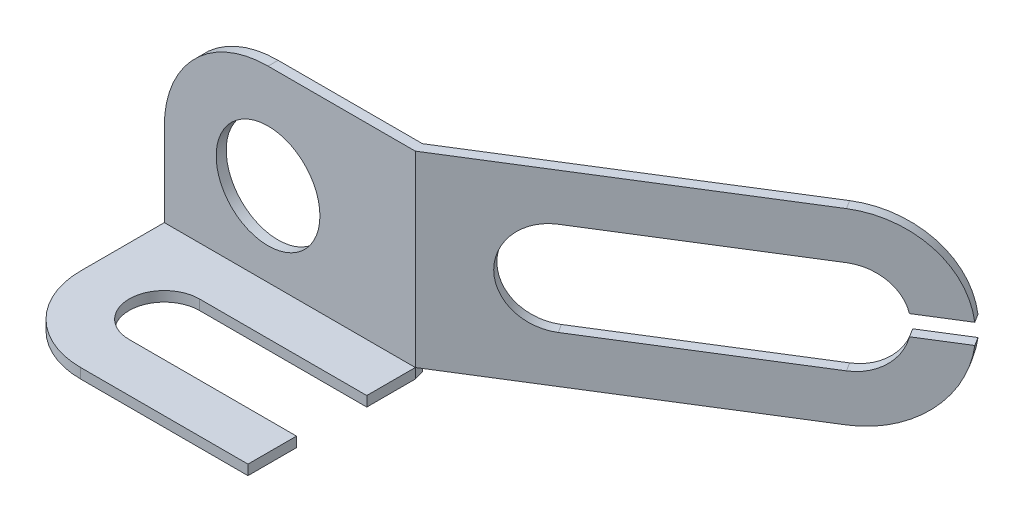
ISO-10303-21;
HEADER;
FILE_DESCRIPTION(('STEP AP214'),'2;1');
FILE_NAME('part.step','',(''),(''),'','','');
FILE_SCHEMA(('AUTOMOTIVE_DESIGN { 1 0 10303 214 1 1 1 1 }'));
ENDSEC;
DATA;
#1=APPLICATION_CONTEXT('core data for automotive mechanical design processes');
#2=APPLICATION_PROTOCOL_DEFINITION('international standard','automotive_design',2000,#1);
#3=PRODUCT_CONTEXT('',#1,'mechanical');
#4=PRODUCT('Part','Part','',(#3));
#5=PRODUCT_RELATED_PRODUCT_CATEGORY('part','',(#4));
#6=PRODUCT_DEFINITION_FORMATION('','',#4);
#7=PRODUCT_DEFINITION_CONTEXT('part definition',#1,'design');
#8=PRODUCT_DEFINITION('design','',#6,#7);
#9=PRODUCT_DEFINITION_SHAPE('','',#8);
#10=(LENGTH_UNIT() NAMED_UNIT(*) SI_UNIT(.MILLI.,.METRE.));
#11=(NAMED_UNIT(*) PLANE_ANGLE_UNIT() SI_UNIT($,.RADIAN.));
#12=(NAMED_UNIT(*) SI_UNIT($,.STERADIAN.) SOLID_ANGLE_UNIT());
#13=UNCERTAINTY_MEASURE_WITH_UNIT(LENGTH_MEASURE(1.E-05),#10,'distance_accuracy_value','');
#14=(GEOMETRIC_REPRESENTATION_CONTEXT(3) GLOBAL_UNCERTAINTY_ASSIGNED_CONTEXT((#13)) GLOBAL_UNIT_ASSIGNED_CONTEXT((#10,
#11,#12)) REPRESENTATION_CONTEXT('',''));
#15=CARTESIAN_POINT('',(0.,0.,0.));
#16=DIRECTION('',(0.,0.,1.));
#17=DIRECTION('',(1.,0.,0.));
#18=AXIS2_PLACEMENT_3D('',#15,#16,#17);
#19=CARTESIAN_POINT('',(0.,1.524,7.366));
#20=DIRECTION('',(-1.,0.,0.));
#21=DIRECTION('',(0.,0.,1.));
#22=AXIS2_PLACEMENT_3D('',#19,#20,#21);
#23=PLANE('',#22);
#24=DIRECTION('',(0.,0.,-1.));
#25=VECTOR('',#24,1.);
#26=CARTESIAN_POINT('',(0.,0.,7.366));
#27=LINE('',#26,#25);
#28=CARTESIAN_POINT('',(0.,0.,7.366));
#29=VERTEX_POINT('',#28);
#30=CARTESIAN_POINT('',(0.,0.,0.));
#31=VERTEX_POINT('',#30);
#32=EDGE_CURVE('E156',#29,#31,#27,.T.);
#33=ORIENTED_EDGE('',*,*,#32,.T.);
#34=DIRECTION('',(0.,-1.,0.));
#35=VECTOR('',#34,1.);
#36=CARTESIAN_POINT('',(0.,3.10941634025308,0.));
#37=LINE('',#36,#35);
#38=CARTESIAN_POINT('',(0.,1.524,0.));
#39=VERTEX_POINT('',#38);
#40=EDGE_CURVE('E342',#39,#31,#37,.T.);
#41=ORIENTED_EDGE('',*,*,#40,.F.);
#42=DIRECTION('',(0.,0.,-1.));
#43=VECTOR('',#42,1.);
#44=CARTESIAN_POINT('',(0.,1.524,7.366));
#45=LINE('',#44,#43);
#46=CARTESIAN_POINT('',(0.,1.524,7.366));
#47=VERTEX_POINT('',#46);
#48=EDGE_CURVE('E172',#47,#39,#45,.T.);
#49=ORIENTED_EDGE('',*,*,#48,.F.);
#50=DIRECTION('',(0.,-1.,0.));
#51=VECTOR('',#50,1.);
#52=CARTESIAN_POINT('',(0.,1.524,7.366));
#53=LINE('',#52,#51);
#54=EDGE_CURVE('E152',#47,#29,#53,.T.);
#55=ORIENTED_EDGE('',*,*,#54,.T.);
#56=EDGE_LOOP('',(#33,#41,#49,#55));
#57=FACE_BOUND('',#56,.T.);
#58=ADVANCED_FACE('F48',(#57),#23,.F.);
#59=CARTESIAN_POINT('',(-38.1,1.524,0.));
#60=DIRECTION('',(1.,0.,0.));
#61=DIRECTION('',(0.,0.,-1.));
#62=AXIS2_PLACEMENT_3D('',#59,#60,#61);
#63=PLANE('',#62);
#64=DIRECTION('',(0.,0.,1.));
#65=VECTOR('',#64,1.);
#66=CARTESIAN_POINT('',(-38.1,0.,0.));
#67=LINE('',#66,#65);
#68=CARTESIAN_POINT('',(-38.1,0.,-1.524));
#69=VERTEX_POINT('',#68);
#70=CARTESIAN_POINT('',(-38.1,0.,12.6999999999999));
#71=VERTEX_POINT('',#70);
#72=EDGE_CURVE('E159',#69,#71,#67,.T.);
#73=ORIENTED_EDGE('',*,*,#72,.T.);
#74=DIRECTION('',(0.,-1.,0.));
#75=VECTOR('',#74,1.);
#76=CARTESIAN_POINT('',(-38.1,1.524,12.6999999999999));
#77=LINE('',#76,#75);
#78=CARTESIAN_POINT('',(-38.1,1.524,12.6999999999999));
#79=VERTEX_POINT('',#78);
#80=EDGE_CURVE('E55',#79,#71,#77,.T.);
#81=ORIENTED_EDGE('',*,*,#80,.F.);
#82=DIRECTION('',(0.,0.,1.));
#83=VECTOR('',#82,1.);
#84=CARTESIAN_POINT('',(-38.1,1.524,0.));
#85=LINE('',#84,#83);
#86=CARTESIAN_POINT('',(-38.1,1.524,0.));
#87=VERTEX_POINT('',#86);
#88=EDGE_CURVE('E209',#87,#79,#85,.T.);
#89=ORIENTED_EDGE('',*,*,#88,.F.);
#90=DIRECTION('',(0.,-1.,0.));
#91=VECTOR('',#90,1.);
#92=CARTESIAN_POINT('',(-38.1,14.224,0.));
#93=LINE('',#92,#91);
#94=CARTESIAN_POINT('',(-38.1,14.224,0.));
#95=VERTEX_POINT('',#94);
#96=EDGE_CURVE('E110',#95,#87,#93,.T.);
#97=ORIENTED_EDGE('',*,*,#96,.F.);
#98=DIRECTION('',(0.,0.,1.));
#99=VECTOR('',#98,1.);
#100=CARTESIAN_POINT('',(-38.1,14.224,-1.524));
#101=LINE('',#100,#99);
#102=CARTESIAN_POINT('',(-38.1,14.224,-1.524));
#103=VERTEX_POINT('',#102);
#104=EDGE_CURVE('E160',#103,#95,#101,.T.);
#105=ORIENTED_EDGE('',*,*,#104,.F.);
#106=DIRECTION('',(0.,-1.,0.));
#107=VECTOR('',#106,1.);
#108=CARTESIAN_POINT('',(-38.1,14.224,-1.524));
#109=LINE('',#108,#107);
#110=EDGE_CURVE('E217',#103,#69,#109,.T.);
#111=ORIENTED_EDGE('',*,*,#110,.T.);
#112=EDGE_LOOP('',(#73,#81,#89,#97,#105,#111));
#113=FACE_BOUND('',#112,.T.);
#114=ADVANCED_FACE('F422',(#113),#63,.F.);
#115=CARTESIAN_POINT('',(-25.4,1.524,12.7));
#116=DIRECTION('',(0.,-1.,0.));
#117=DIRECTION('',(0.,0.,-1.));
#118=AXIS2_PLACEMENT_3D('',#115,#116,#117);
#119=CYLINDRICAL_SURFACE('',#118,12.7);
#120=CARTESIAN_POINT('',(-25.4,0.,12.7));
#121=DIRECTION('',(0.,1.,0.));
#122=DIRECTION('',(0.,0.,-1.));
#123=AXIS2_PLACEMENT_3D('',#120,#121,#122);
#124=CIRCLE('',#123,12.7);
#125=CARTESIAN_POINT('',(-25.3999999999999,0.,25.4));
#126=VERTEX_POINT('',#125);
#127=EDGE_CURVE('E162',#71,#126,#124,.T.);
#128=ORIENTED_EDGE('',*,*,#127,.T.);
#129=DIRECTION('',(0.,-1.,0.));
#130=VECTOR('',#129,1.);
#131=CARTESIAN_POINT('',(-25.3999999999999,1.524,25.4));
#132=LINE('',#131,#130);
#133=CARTESIAN_POINT('',(-25.3999999999999,1.524,25.4));
#134=VERTEX_POINT('',#133);
#135=EDGE_CURVE('E179',#134,#126,#132,.T.);
#136=ORIENTED_EDGE('',*,*,#135,.F.);
#137=CARTESIAN_POINT('',(-25.4,1.524,12.7));
#138=DIRECTION('',(0.,1.,0.));
#139=DIRECTION('',(0.,0.,-1.));
#140=AXIS2_PLACEMENT_3D('',#137,#138,#139);
#141=CIRCLE('',#140,12.7);
#142=EDGE_CURVE('E188',#79,#134,#141,.T.);
#143=ORIENTED_EDGE('',*,*,#142,.F.);
#144=ORIENTED_EDGE('',*,*,#80,.T.);
#145=EDGE_LOOP('',(#128,#136,#143,#144));
#146=FACE_BOUND('',#145,.T.);
#147=ADVANCED_FACE('F186',(#146),#119,.T.);
#148=CARTESIAN_POINT('',(-25.3999999999999,1.524,25.4));
#149=DIRECTION('',(0.,0.,-1.));
#150=DIRECTION('',(-1.,0.,0.));
#151=AXIS2_PLACEMENT_3D('',#148,#149,#150);
#152=PLANE('',#151);
#153=DIRECTION('',(1.,0.,0.));
#154=VECTOR('',#153,1.);
#155=CARTESIAN_POINT('',(-25.3999999999999,0.,25.4));
#156=LINE('',#155,#154);
#157=CARTESIAN_POINT('',(0.,0.,25.4));
#158=VERTEX_POINT('',#157);
#159=EDGE_CURVE('E164',#126,#158,#156,.T.);
#160=ORIENTED_EDGE('',*,*,#159,.T.);
#161=DIRECTION('',(0.,-1.,0.));
#162=VECTOR('',#161,1.);
#163=CARTESIAN_POINT('',(0.,1.524,25.4));
#164=LINE('',#163,#162);
#165=CARTESIAN_POINT('',(0.,1.524,25.4));
#166=VERTEX_POINT('',#165);
#167=EDGE_CURVE('E176',#166,#158,#164,.T.);
#168=ORIENTED_EDGE('',*,*,#167,.F.);
#169=DIRECTION('',(1.,0.,0.));
#170=VECTOR('',#169,1.);
#171=CARTESIAN_POINT('',(-25.3999999999999,1.524,25.4));
#172=LINE('',#171,#170);
#173=EDGE_CURVE('E205',#134,#166,#172,.T.);
#174=ORIENTED_EDGE('',*,*,#173,.F.);
#175=ORIENTED_EDGE('',*,*,#135,.T.);
#176=EDGE_LOOP('',(#160,#168,#174,#175));
#177=FACE_BOUND('',#176,.T.);
#178=ADVANCED_FACE('F201',(#177),#152,.F.);
#179=CARTESIAN_POINT('',(0.,1.524,25.4));
#180=DIRECTION('',(-1.,0.,0.));
#181=DIRECTION('',(0.,0.,1.));
#182=AXIS2_PLACEMENT_3D('',#179,#180,#181);
#183=PLANE('',#182);
#184=DIRECTION('',(0.,0.,-1.));
#185=VECTOR('',#184,1.);
#186=CARTESIAN_POINT('',(0.,0.,25.4));
#187=LINE('',#186,#185);
#188=CARTESIAN_POINT('',(0.,0.,18.034));
#189=VERTEX_POINT('',#188);
#190=EDGE_CURVE('E166',#158,#189,#187,.T.);
#191=ORIENTED_EDGE('',*,*,#190,.T.);
#192=DIRECTION('',(0.,-1.,0.));
#193=VECTOR('',#192,1.);
#194=CARTESIAN_POINT('',(0.,1.524,18.034));
#195=LINE('',#194,#193);
#196=CARTESIAN_POINT('',(0.,1.524,18.034));
#197=VERTEX_POINT('',#196);
#198=EDGE_CURVE('E147',#197,#189,#195,.T.);
#199=ORIENTED_EDGE('',*,*,#198,.F.);
#200=DIRECTION('',(0.,0.,-1.));
#201=VECTOR('',#200,1.);
#202=CARTESIAN_POINT('',(0.,1.524,25.4));
#203=LINE('',#202,#201);
#204=EDGE_CURVE('E135',#166,#197,#203,.T.);
#205=ORIENTED_EDGE('',*,*,#204,.F.);
#206=ORIENTED_EDGE('',*,*,#167,.T.);
#207=EDGE_LOOP('',(#191,#199,#205,#206));
#208=FACE_BOUND('',#207,.T.);
#209=ADVANCED_FACE('F204',(#208),#183,.F.);
#210=CARTESIAN_POINT('',(0.,1.524,18.034));
#211=DIRECTION('',(0.,0.,1.));
#212=DIRECTION('',(1.,0.,0.));
#213=AXIS2_PLACEMENT_3D('',#210,#211,#212);
#214=PLANE('',#213);
#215=DIRECTION('',(-1.,0.,0.));
#216=VECTOR('',#215,1.);
#217=CARTESIAN_POINT('',(0.,0.,18.034));
#218=LINE('',#217,#216);
#219=CARTESIAN_POINT('',(-25.4,0.,18.034));
#220=VERTEX_POINT('',#219);
#221=EDGE_CURVE('E144',#189,#220,#218,.T.);
#222=ORIENTED_EDGE('',*,*,#221,.T.);
#223=DIRECTION('',(0.,-1.,0.));
#224=VECTOR('',#223,1.);
#225=CARTESIAN_POINT('',(-25.4,1.524,18.034));
#226=LINE('',#225,#224);
#227=CARTESIAN_POINT('',(-25.4,1.524,18.034));
#228=VERTEX_POINT('',#227);
#229=EDGE_CURVE('E141',#228,#220,#226,.T.);
#230=ORIENTED_EDGE('',*,*,#229,.F.);
#231=DIRECTION('',(-1.,0.,0.));
#232=VECTOR('',#231,1.);
#233=CARTESIAN_POINT('',(0.,1.524,18.034));
#234=LINE('',#233,#232);
#235=EDGE_CURVE('E128',#197,#228,#234,.T.);
#236=ORIENTED_EDGE('',*,*,#235,.F.);
#237=ORIENTED_EDGE('',*,*,#198,.T.);
#238=EDGE_LOOP('',(#222,#230,#236,#237));
#239=FACE_BOUND('',#238,.T.);
#240=ADVANCED_FACE('F142',(#239),#214,.F.);
#241=CARTESIAN_POINT('',(-25.4,1.524,12.7));
#242=DIRECTION('',(0.,-1.,0.));
#243=DIRECTION('',(0.,0.,-1.));
#244=AXIS2_PLACEMENT_3D('',#241,#242,#243);
#245=CYLINDRICAL_SURFACE('',#244,5.334);
#246=CARTESIAN_POINT('',(-25.4,0.,12.7));
#247=DIRECTION('',(0.,-1.,0.));
#248=DIRECTION('',(0.,0.,1.));
#249=AXIS2_PLACEMENT_3D('',#246,#247,#248);
#250=CIRCLE('',#249,5.334);
#251=CARTESIAN_POINT('',(-25.4,0.,7.366));
#252=VERTEX_POINT('',#251);
#253=EDGE_CURVE('E169',#220,#252,#250,.T.);
#254=ORIENTED_EDGE('',*,*,#253,.T.);
#255=DIRECTION('',(0.,-1.,0.));
#256=VECTOR('',#255,1.);
#257=CARTESIAN_POINT('',(-25.4,1.524,7.366));
#258=LINE('',#257,#256);
#259=CARTESIAN_POINT('',(-25.4,1.524,7.366));
#260=VERTEX_POINT('',#259);
#261=EDGE_CURVE('E148',#260,#252,#258,.T.);
#262=ORIENTED_EDGE('',*,*,#261,.F.);
#263=CARTESIAN_POINT('',(-25.4,1.524,12.7));
#264=DIRECTION('',(0.,-1.,0.));
#265=DIRECTION('',(0.,0.,1.));
#266=AXIS2_PLACEMENT_3D('',#263,#264,#265);
#267=CIRCLE('',#266,5.334);
#268=EDGE_CURVE('E132',#228,#260,#267,.T.);
#269=ORIENTED_EDGE('',*,*,#268,.F.);
#270=ORIENTED_EDGE('',*,*,#229,.T.);
#271=EDGE_LOOP('',(#254,#262,#269,#270));
#272=FACE_BOUND('',#271,.T.);
#273=ADVANCED_FACE('F150',(#272),#245,.F.);
#274=CARTESIAN_POINT('',(-25.4,1.524,7.366));
#275=DIRECTION('',(0.,0.,-1.));
#276=DIRECTION('',(-1.,0.,0.));
#277=AXIS2_PLACEMENT_3D('',#274,#275,#276);
#278=PLANE('',#277);
#279=DIRECTION('',(1.,0.,0.));
#280=VECTOR('',#279,1.);
#281=CARTESIAN_POINT('',(-25.4,0.,7.366));
#282=LINE('',#281,#280);
#283=EDGE_CURVE('E101',#252,#29,#282,.T.);
#284=ORIENTED_EDGE('',*,*,#283,.T.);
#285=ORIENTED_EDGE('',*,*,#54,.F.);
#286=DIRECTION('',(1.,0.,0.));
#287=VECTOR('',#286,1.);
#288=CARTESIAN_POINT('',(-25.4,1.524,7.366));
#289=LINE('',#288,#287);
#290=EDGE_CURVE('E71',#260,#47,#289,.T.);
#291=ORIENTED_EDGE('',*,*,#290,.F.);
#292=ORIENTED_EDGE('',*,*,#261,.T.);
#293=EDGE_LOOP('',(#284,#285,#291,#292));
#294=FACE_BOUND('',#293,.T.);
#295=ADVANCED_FACE('F497',(#294),#278,.F.);
#296=CARTESIAN_POINT('',(-25.4,1.524,12.7));
#297=DIRECTION('',(0.,-1.,0.));
#298=DIRECTION('',(0.,0.,-1.));
#299=AXIS2_PLACEMENT_3D('',#296,#297,#298);
#300=PLANE('',#299);
#301=ORIENTED_EDGE('',*,*,#48,.T.);
#302=DIRECTION('',(-1.,0.,0.));
#303=VECTOR('',#302,1.);
#304=CARTESIAN_POINT('',(0.,1.524,0.));
#305=LINE('',#304,#303);
#306=EDGE_CURVE('E211',#39,#87,#305,.T.);
#307=ORIENTED_EDGE('',*,*,#306,.T.);
#308=ORIENTED_EDGE('',*,*,#88,.T.);
#309=ORIENTED_EDGE('',*,*,#142,.T.);
#310=ORIENTED_EDGE('',*,*,#173,.T.);
#311=ORIENTED_EDGE('',*,*,#204,.T.);
#312=ORIENTED_EDGE('',*,*,#235,.T.);
#313=ORIENTED_EDGE('',*,*,#268,.T.);
#314=ORIENTED_EDGE('',*,*,#290,.T.);
#315=EDGE_LOOP('',(#301,#307,#308,#309,#310,#311,#312,#313,#314));
#316=FACE_BOUND('',#315,.T.);
#317=ADVANCED_FACE('F130',(#316),#300,.F.);
#318=CARTESIAN_POINT('',(-25.4,0.,12.7));
#319=DIRECTION('',(0.,-1.,0.));
#320=DIRECTION('',(0.,0.,-1.));
#321=AXIS2_PLACEMENT_3D('',#318,#319,#320);
#322=PLANE('',#321);
#323=DIRECTION('',(-0.275637355816991,0.,-0.961261695938321));
#324=VECTOR('',#323,1.);
#325=CARTESIAN_POINT('',(0.,0.,0.));
#326=LINE('',#325,#324);
#327=CARTESIAN_POINT('',(-0.436999967896409,0.,-1.524));
#328=VERTEX_POINT('',#327);
#329=EDGE_CURVE('E345',#31,#328,#326,.T.);
#330=ORIENTED_EDGE('',*,*,#329,.F.);
#331=ORIENTED_EDGE('',*,*,#32,.F.);
#332=ORIENTED_EDGE('',*,*,#283,.F.);
#333=ORIENTED_EDGE('',*,*,#253,.F.);
#334=ORIENTED_EDGE('',*,*,#221,.F.);
#335=ORIENTED_EDGE('',*,*,#190,.F.);
#336=ORIENTED_EDGE('',*,*,#159,.F.);
#337=ORIENTED_EDGE('',*,*,#127,.F.);
#338=ORIENTED_EDGE('',*,*,#72,.F.);
#339=DIRECTION('',(1.,0.,0.));
#340=VECTOR('',#339,1.);
#341=CARTESIAN_POINT('',(0.,0.,-1.524));
#342=LINE('',#341,#340);
#343=EDGE_CURVE('E221',#69,#328,#342,.T.);
#344=ORIENTED_EDGE('',*,*,#343,.T.);
#345=EDGE_LOOP('',(#330,#331,#332,#333,#334,#335,#336,#337,#338,#344));
#346=FACE_BOUND('',#345,.T.);
#347=ADVANCED_FACE('F195',(#346),#322,.T.);
#348=CARTESIAN_POINT('',(-22.352,14.224,0.));
#349=DIRECTION('',(0.,0.,1.));
#350=DIRECTION('',(1.,0.,0.));
#351=AXIS2_PLACEMENT_3D('',#348,#349,#350);
#352=PLANE('',#351);
#353=CARTESIAN_POINT('',(-22.352,14.224,0.));
#354=DIRECTION('',(0.,0.,1.));
#355=DIRECTION('',(1.,0.,0.));
#356=AXIS2_PLACEMENT_3D('',#353,#354,#355);
#357=CIRCLE('',#356,7.874);
#358=CARTESIAN_POINT('',(-14.478,14.224,0.));
#359=VERTEX_POINT('',#358);
#360=EDGE_CURVE('E240',#359,#359,#357,.T.);
#361=ORIENTED_EDGE('',*,*,#360,.F.);
#362=EDGE_LOOP('',(#361));
#363=FACE_BOUND('',#362,.T.);
#364=ORIENTED_EDGE('',*,*,#306,.F.);
#365=DIRECTION('',(0.,1.,0.));
#366=VECTOR('',#365,1.);
#367=CARTESIAN_POINT('',(0.,0.,0.));
#368=LINE('',#367,#366);
#369=CARTESIAN_POINT('',(0.,29.972,0.));
#370=VERTEX_POINT('',#369);
#371=EDGE_CURVE('E227',#39,#370,#368,.T.);
#372=ORIENTED_EDGE('',*,*,#371,.T.);
#373=DIRECTION('',(-1.,0.,0.));
#374=VECTOR('',#373,1.);
#375=CARTESIAN_POINT('',(0.,29.972,0.));
#376=LINE('',#375,#374);
#377=CARTESIAN_POINT('',(-22.352,29.972,0.));
#378=VERTEX_POINT('',#377);
#379=EDGE_CURVE('E224',#370,#378,#376,.T.);
#380=ORIENTED_EDGE('',*,*,#379,.T.);
#381=CARTESIAN_POINT('',(-22.352,14.224,0.));
#382=DIRECTION('',(0.,0.,1.));
#383=DIRECTION('',(1.,0.,0.));
#384=AXIS2_PLACEMENT_3D('',#381,#382,#383);
#385=CIRCLE('',#384,15.748);
#386=EDGE_CURVE('E222',#378,#95,#385,.T.);
#387=ORIENTED_EDGE('',*,*,#386,.T.);
#388=ORIENTED_EDGE('',*,*,#96,.T.);
#389=EDGE_LOOP('',(#364,#372,#380,#387,#388));
#390=FACE_BOUND('',#389,.T.);
#391=ADVANCED_FACE('F421',(#363,#390),#352,.T.);
#392=CARTESIAN_POINT('',(-22.352,14.224,-1.524));
#393=DIRECTION('',(0.,0.,1.));
#394=DIRECTION('',(1.,0.,0.));
#395=AXIS2_PLACEMENT_3D('',#392,#393,#394);
#396=CYLINDRICAL_SURFACE('',#395,15.748);
#397=ORIENTED_EDGE('',*,*,#386,.F.);
#398=DIRECTION('',(0.,0.,1.));
#399=VECTOR('',#398,1.);
#400=CARTESIAN_POINT('',(-22.352,29.972,-1.524));
#401=LINE('',#400,#399);
#402=CARTESIAN_POINT('',(-22.352,29.972,-1.524));
#403=VERTEX_POINT('',#402);
#404=EDGE_CURVE('E214',#403,#378,#401,.T.);
#405=ORIENTED_EDGE('',*,*,#404,.F.);
#406=CARTESIAN_POINT('',(-22.352,14.224,-1.524));
#407=DIRECTION('',(0.,0.,1.));
#408=DIRECTION('',(1.,0.,0.));
#409=AXIS2_PLACEMENT_3D('',#406,#407,#408);
#410=CIRCLE('',#409,15.748);
#411=EDGE_CURVE('E233',#403,#103,#410,.T.);
#412=ORIENTED_EDGE('',*,*,#411,.T.);
#413=ORIENTED_EDGE('',*,*,#104,.T.);
#414=EDGE_LOOP('',(#397,#405,#412,#413));
#415=FACE_BOUND('',#414,.T.);
#416=ADVANCED_FACE('F420',(#415),#396,.T.);
#417=CARTESIAN_POINT('',(0.,29.972,-1.524));
#418=DIRECTION('',(0.,1.,0.));
#419=DIRECTION('',(-1.,0.,0.));
#420=AXIS2_PLACEMENT_3D('',#417,#418,#419);
#421=PLANE('',#420);
#422=ORIENTED_EDGE('',*,*,#379,.F.);
#423=DIRECTION('',(-0.848048096156425,0.,0.529919264233206));
#424=VECTOR('',#423,1.);
#425=CARTESIAN_POINT('',(0.,29.972,0.));
#426=LINE('',#425,#424);
#427=CARTESIAN_POINT('',(40.2805884712379,29.972,-25.1701052125488));
#428=VERTEX_POINT('',#427);
#429=EDGE_CURVE('E276',#428,#370,#426,.T.);
#430=ORIENTED_EDGE('',*,*,#429,.F.);
#431=DIRECTION('',(0.529919264233206,0.,0.848048096156425));
#432=VECTOR('',#431,1.);
#433=CARTESIAN_POINT('',(39.4729915125465,29.972,-26.4625305110912));
#434=LINE('',#433,#432);
#435=CARTESIAN_POINT('',(39.4729915125465,29.972,-26.4625305110912));
#436=VERTEX_POINT('',#435);
#437=EDGE_CURVE('E243',#436,#428,#434,.T.);
#438=ORIENTED_EDGE('',*,*,#437,.F.);
#439=DIRECTION('',(-0.848048096156425,0.,0.529919264233206));
#440=VECTOR('',#439,1.);
#441=CARTESIAN_POINT('',(-0.807596958691406,29.972,-1.29242529854239));
#442=LINE('',#441,#440);
#443=CARTESIAN_POINT('',(-0.436999967896413,29.972,-1.52400000000001));
#444=VERTEX_POINT('',#443);
#445=EDGE_CURVE('E250',#436,#444,#442,.T.);
#446=ORIENTED_EDGE('',*,*,#445,.T.);
#447=DIRECTION('',(-1.,0.,0.));
#448=VECTOR('',#447,1.);
#449=CARTESIAN_POINT('',(0.,29.972,-1.524));
#450=LINE('',#449,#448);
#451=EDGE_CURVE('E236',#444,#403,#450,.T.);
#452=ORIENTED_EDGE('',*,*,#451,.T.);
#453=ORIENTED_EDGE('',*,*,#404,.T.);
#454=EDGE_LOOP('',(#422,#430,#438,#446,#452,#453));
#455=FACE_BOUND('',#454,.T.);
#456=ADVANCED_FACE('F376',(#455),#421,.T.);
#457=CARTESIAN_POINT('',(-22.352,14.224,-1.524));
#458=DIRECTION('',(0.,0.,1.));
#459=DIRECTION('',(1.,0.,0.));
#460=AXIS2_PLACEMENT_3D('',#457,#458,#459);
#461=PLANE('',#460);
#462=CARTESIAN_POINT('',(-22.352,14.224,-1.524));
#463=DIRECTION('',(0.,0.,1.));
#464=DIRECTION('',(1.,0.,0.));
#465=AXIS2_PLACEMENT_3D('',#462,#463,#464);
#466=CIRCLE('',#465,7.874);
#467=CARTESIAN_POINT('',(-14.478,14.224,-1.524));
#468=VERTEX_POINT('',#467);
#469=EDGE_CURVE('E230',#468,#468,#466,.T.);
#470=ORIENTED_EDGE('',*,*,#469,.T.);
#471=EDGE_LOOP('',(#470));
#472=FACE_BOUND('',#471,.T.);
#473=DIRECTION('',(0.,-1.,0.));
#474=VECTOR('',#473,1.);
#475=CARTESIAN_POINT('',(-0.436999967896409,14.224,-1.524));
#476=LINE('',#475,#474);
#477=CARTESIAN_POINT('',(-0.436999967896409,1.524,-1.524));
#478=VERTEX_POINT('',#477);
#479=EDGE_CURVE('E13',#444,#478,#476,.T.);
#480=ORIENTED_EDGE('',*,*,#479,.T.);
#481=DIRECTION('',(0.,-1.,0.));
#482=VECTOR('',#481,1.);
#483=CARTESIAN_POINT('',(-0.436999967896409,3.10941634025308,-1.524));
#484=LINE('',#483,#482);
#485=EDGE_CURVE('E341',#478,#328,#484,.T.);
#486=ORIENTED_EDGE('',*,*,#485,.T.);
#487=ORIENTED_EDGE('',*,*,#343,.F.);
#488=ORIENTED_EDGE('',*,*,#110,.F.);
#489=ORIENTED_EDGE('',*,*,#411,.F.);
#490=ORIENTED_EDGE('',*,*,#451,.F.);
#491=EDGE_LOOP('',(#480,#486,#487,#488,#489,#490));
#492=FACE_BOUND('',#491,.T.);
#493=ADVANCED_FACE('F359',(#472,#492),#461,.F.);
#494=CARTESIAN_POINT('',(-22.352,14.224,-1.524));
#495=DIRECTION('',(0.,0.,1.));
#496=DIRECTION('',(1.,0.,0.));
#497=AXIS2_PLACEMENT_3D('',#494,#495,#496);
#498=CYLINDRICAL_SURFACE('',#497,7.874);
#499=CARTESIAN_POINT('',(-14.478,14.224,-1.524));
#500=CARTESIAN_POINT('',(-14.478,14.224,-1.508125));
#501=CARTESIAN_POINT('',(-14.478,14.224,-1.49225));
#502=CARTESIAN_POINT('',(-14.478,14.224,-1.4605));
#503=CARTESIAN_POINT('',(-14.478,14.224,-1.444625));
#504=CARTESIAN_POINT('',(-14.478,14.224,-1.412875));
#505=CARTESIAN_POINT('',(-14.478,14.224,-1.397));
#506=CARTESIAN_POINT('',(-14.478,14.224,-1.36525));
#507=CARTESIAN_POINT('',(-14.478,14.224,-1.349375));
#508=CARTESIAN_POINT('',(-14.478,14.224,-1.317625));
#509=CARTESIAN_POINT('',(-14.478,14.224,-1.30175));
#510=CARTESIAN_POINT('',(-14.478,14.224,-1.27));
#511=CARTESIAN_POINT('',(-14.478,14.224,-1.254125));
#512=CARTESIAN_POINT('',(-14.478,14.224,-1.222375));
#513=CARTESIAN_POINT('',(-14.478,14.224,-1.2065));
#514=CARTESIAN_POINT('',(-14.478,14.224,-1.17475));
#515=CARTESIAN_POINT('',(-14.478,14.224,-1.158875));
#516=CARTESIAN_POINT('',(-14.478,14.224,-1.127125));
#517=CARTESIAN_POINT('',(-14.478,14.224,-1.11125));
#518=CARTESIAN_POINT('',(-14.478,14.224,-1.0795));
#519=CARTESIAN_POINT('',(-14.478,14.224,-1.063625));
#520=CARTESIAN_POINT('',(-14.478,14.224,-1.031875));
#521=CARTESIAN_POINT('',(-14.478,14.224,-1.016));
#522=CARTESIAN_POINT('',(-14.478,14.224,-0.98425));
#523=CARTESIAN_POINT('',(-14.478,14.224,-0.968375));
#524=CARTESIAN_POINT('',(-14.478,14.224,-0.936625));
#525=CARTESIAN_POINT('',(-14.478,14.224,-0.92075));
#526=CARTESIAN_POINT('',(-14.478,14.224,-0.889));
#527=CARTESIAN_POINT('',(-14.478,14.224,-0.873125));
#528=CARTESIAN_POINT('',(-14.478,14.224,-0.841375));
#529=CARTESIAN_POINT('',(-14.478,14.224,-0.8255));
#530=CARTESIAN_POINT('',(-14.478,14.224,-0.79375));
#531=CARTESIAN_POINT('',(-14.478,14.224,-0.777875));
#532=CARTESIAN_POINT('',(-14.478,14.224,-0.746125));
#533=CARTESIAN_POINT('',(-14.478,14.224,-0.73025));
#534=CARTESIAN_POINT('',(-14.478,14.224,-0.6985));
#535=CARTESIAN_POINT('',(-14.478,14.224,-0.682625));
#536=CARTESIAN_POINT('',(-14.478,14.224,-0.650875));
#537=CARTESIAN_POINT('',(-14.478,14.224,-0.635));
#538=CARTESIAN_POINT('',(-14.478,14.224,-0.60325));
#539=CARTESIAN_POINT('',(-14.478,14.224,-0.587375));
#540=CARTESIAN_POINT('',(-14.478,14.224,-0.555625));
#541=CARTESIAN_POINT('',(-14.478,14.224,-0.53975));
#542=CARTESIAN_POINT('',(-14.478,14.224,-0.508));
#543=CARTESIAN_POINT('',(-14.478,14.224,-0.492125));
#544=CARTESIAN_POINT('',(-14.478,14.224,-0.460375));
#545=CARTESIAN_POINT('',(-14.478,14.224,-0.4445));
#546=CARTESIAN_POINT('',(-14.478,14.224,-0.41275));
#547=CARTESIAN_POINT('',(-14.478,14.224,-0.396875));
#548=CARTESIAN_POINT('',(-14.478,14.224,-0.365125));
#549=CARTESIAN_POINT('',(-14.478,14.224,-0.34925));
#550=CARTESIAN_POINT('',(-14.478,14.224,-0.3175));
#551=CARTESIAN_POINT('',(-14.478,14.224,-0.301625));
#552=CARTESIAN_POINT('',(-14.478,14.224,-0.269875));
#553=CARTESIAN_POINT('',(-14.478,14.224,-0.254));
#554=CARTESIAN_POINT('',(-14.478,14.224,-0.22225));
#555=CARTESIAN_POINT('',(-14.478,14.224,-0.206375));
#556=CARTESIAN_POINT('',(-14.478,14.224,-0.174625));
#557=CARTESIAN_POINT('',(-14.478,14.224,-0.15875));
#558=CARTESIAN_POINT('',(-14.478,14.224,-0.127));
#559=CARTESIAN_POINT('',(-14.478,14.224,-0.111125));
#560=CARTESIAN_POINT('',(-14.478,14.224,-0.079375));
#561=CARTESIAN_POINT('',(-14.478,14.224,-0.0635));
#562=CARTESIAN_POINT('',(-14.478,14.224,-0.0317499999999999));
#563=CARTESIAN_POINT('',(-14.478,14.224,-0.015875));
#564=CARTESIAN_POINT('',(-14.478,14.224,0.));
#565=B_SPLINE_CURVE_WITH_KNOTS('',3,(#499,#500,#501,#502,#503,#504,#505,#506,#507,#508,#509,
#510,#511,#512,#513,#514,#515,#516,#517,#518,#519,#520,#521,#522,#523,#524,#525,#526,#527,#528,
#529,#530,#531,#532,#533,#534,#535,#536,#537,#538,#539,#540,#541,#542,#543,#544,#545,#546,#547,
#548,#549,#550,#551,#552,#553,#554,#555,#556,#557,#558,#559,#560,#561,#562,#563,#564),
.UNSPECIFIED.,.F.,.F.,(4,2,2,2,2,2,2,2,2,2,2,2,2,2,2,2,2,2,2,2,2,2,2,2,2,2,2,2,2,2,2,2,4),(0.,
0.0476250000000001,0.0952500000000001,0.142875,0.1905,0.238125,0.28575,0.333375,0.381,0.428625,
0.47625,0.523875,0.5715,0.619125,0.66675,0.714375,0.762,0.809625,0.85725,0.904875,0.9525,
1.000125,1.04775,1.095375,1.143,1.190625,1.23825,1.285875,1.3335,1.381125,1.42875,1.476375,
1.524),.UNSPECIFIED.);
#566=EDGE_CURVE('BSEAM482',#468,#359,#565,.T.);
#567=ORIENTED_EDGE('',*,*,#469,.F.);
#568=ORIENTED_EDGE('',*,*,#360,.T.);
#569=ORIENTED_EDGE('',*,*,#566,.T.);
#570=ORIENTED_EDGE('',*,*,#566,.F.);
#571=EDGE_LOOP('',(#567,#569,#568,#570));
#572=FACE_BOUND('',#571,.T.);
#573=ADVANCED_FACE('F482',(#572),#498,.F.);
#574=CARTESIAN_POINT('',(39.4729915125465,1.524,-26.4625305110912));
#575=DIRECTION('',(0.,-1.,0.));
#576=DIRECTION('',(1.,0.,0.));
#577=AXIS2_PLACEMENT_3D('',#574,#575,#576);
#578=PLANE('',#577);
#579=DIRECTION('',(0.848048096156425,0.,-0.529919264233206));
#580=VECTOR('',#579,1.);
#581=CARTESIAN_POINT('',(40.2805884712379,1.524,-25.1701052125488));
#582=LINE('',#581,#580);
#583=CARTESIAN_POINT('',(40.2805884712379,1.524,-25.1701052125488));
#584=VERTEX_POINT('',#583);
#585=EDGE_CURVE('E307',#39,#584,#582,.T.);
#586=ORIENTED_EDGE('',*,*,#585,.F.);
#587=DIRECTION('',(0.275637355816991,0.,0.961261695938321));
#588=VECTOR('',#587,1.);
#589=CARTESIAN_POINT('',(0.,1.524,0.));
#590=LINE('',#589,#588);
#591=EDGE_CURVE('E62',#478,#39,#590,.T.);
#592=ORIENTED_EDGE('',*,*,#591,.F.);
#593=DIRECTION('',(0.848048096156425,0.,-0.529919264233206));
#594=VECTOR('',#593,1.);
#595=CARTESIAN_POINT('',(39.4729915125465,1.524,-26.4625305110912));
#596=LINE('',#595,#594);
#597=CARTESIAN_POINT('',(39.4729915125465,1.524,-26.4625305110912));
#598=VERTEX_POINT('',#597);
#599=EDGE_CURVE('E279',#478,#598,#596,.T.);
#600=ORIENTED_EDGE('',*,*,#599,.T.);
#601=DIRECTION('',(0.529919264233206,0.,0.848048096156425));
#602=VECTOR('',#601,1.);
#603=CARTESIAN_POINT('',(39.4729915125465,1.524,-26.4625305110912));
#604=LINE('',#603,#602);
#605=EDGE_CURVE('E246',#598,#584,#604,.T.);
#606=ORIENTED_EDGE('',*,*,#605,.T.);
#607=EDGE_LOOP('',(#586,#592,#600,#606));
#608=FACE_BOUND('',#607,.T.);
#609=ADVANCED_FACE('F480',(#608),#578,.T.);
#610=CARTESIAN_POINT('',(39.4729915125465,15.748,-26.4625305110912));
#611=DIRECTION('',(-0.529919264233206,0.,-0.848048096156425));
#612=DIRECTION('',(-0.848048096156425,0.,0.529919264233206));
#613=AXIS2_PLACEMENT_3D('',#610,#611,#612);
#614=PLANE('',#613);
#615=ORIENTED_EDGE('',*,*,#479,.F.);
#616=ORIENTED_EDGE('',*,*,#445,.F.);
#617=CARTESIAN_POINT('',(39.4729915125465,15.748,-26.4625305110912));
#618=DIRECTION('',(0.529919264233206,0.,0.848048096156425));
#619=DIRECTION('',(-0.848048096156425,0.,0.529919264233206));
#620=AXIS2_PLACEMENT_3D('',#617,#618,#619);
#621=CIRCLE('',#620,14.224);
#622=CARTESIAN_POINT('',(51.4661907106203,17.272,-33.9567131213111));
#623=VERTEX_POINT('',#622);
#624=EDGE_CURVE('E312',#623,#436,#621,.T.);
#625=ORIENTED_EDGE('',*,*,#624,.F.);
#626=DIRECTION('',(0.848048096156425,0.,-0.529919264233206));
#627=VECTOR('',#626,1.);
#628=CARTESIAN_POINT('',(45.3642082278724,17.272,-30.1437712819543));
#629=LINE('',#628,#627);
#630=CARTESIAN_POINT('',(45.3642082278724,17.272,-30.1437712819543));
#631=VERTEX_POINT('',#630);
#632=EDGE_CURVE('E315',#631,#623,#629,.T.);
#633=ORIENTED_EDGE('',*,*,#632,.F.);
#634=CARTESIAN_POINT('',(39.4729915125465,15.748,-26.4625305110912));
#635=DIRECTION('',(-0.529919264233206,0.,-0.848048096156425));
#636=DIRECTION('',(0.848048096156425,0.,-0.529919264233206));
#637=AXIS2_PLACEMENT_3D('',#634,#635,#636);
#638=CIRCLE('',#637,7.11200000000001);
#639=CARTESIAN_POINT('',(39.4729915125465,22.86,-26.4625305110912));
#640=VERTEX_POINT('',#639);
#641=EDGE_CURVE('E318',#640,#631,#638,.T.);
#642=ORIENTED_EDGE('',*,*,#641,.F.);
#643=DIRECTION('',(0.848048096156425,0.,-0.529919264233206));
#644=VECTOR('',#643,1.);
#645=CARTESIAN_POINT('',(12.54746445958,22.86,-9.63759387168692));
#646=LINE('',#645,#644);
#647=CARTESIAN_POINT('',(12.54746445958,22.86,-9.63759387168692));
#648=VERTEX_POINT('',#647);
#649=EDGE_CURVE('E321',#648,#640,#646,.T.);
#650=ORIENTED_EDGE('',*,*,#649,.F.);
#651=CARTESIAN_POINT('',(12.54746445958,15.748,-9.63759387168692));
#652=DIRECTION('',(-0.529919264233206,0.,-0.848048096156425));
#653=DIRECTION('',(0.848048096156425,0.,-0.529919264233206));
#654=AXIS2_PLACEMENT_3D('',#651,#652,#653);
#655=CIRCLE('',#654,7.112);
#656=CARTESIAN_POINT('',(12.54746445958,8.63599999999999,-9.63759387168692));
#657=VERTEX_POINT('',#656);
#658=EDGE_CURVE('E324',#657,#648,#655,.T.);
#659=ORIENTED_EDGE('',*,*,#658,.F.);
#660=DIRECTION('',(-0.848048096156425,0.,0.529919264233206));
#661=VECTOR('',#660,1.);
#662=CARTESIAN_POINT('',(12.54746445958,8.63599999999999,-9.63759387168692));
#663=LINE('',#662,#661);
#664=CARTESIAN_POINT('',(39.4729915125465,8.63599999999999,-26.4625305110912));
#665=VERTEX_POINT('',#664);
#666=EDGE_CURVE('E327',#665,#657,#663,.T.);
#667=ORIENTED_EDGE('',*,*,#666,.F.);
#668=CARTESIAN_POINT('',(39.4729915125465,15.748,-26.4625305110912));
#669=DIRECTION('',(-0.529919264233206,0.,-0.848048096156425));
#670=DIRECTION('',(0.848048096156425,0.,-0.529919264233206));
#671=AXIS2_PLACEMENT_3D('',#668,#669,#670);
#672=CIRCLE('',#671,7.11200000000001);
#673=CARTESIAN_POINT('',(45.3642082278724,14.224,-30.1437712819543));
#674=VERTEX_POINT('',#673);
#675=EDGE_CURVE('E330',#674,#665,#672,.T.);
#676=ORIENTED_EDGE('',*,*,#675,.F.);
#677=DIRECTION('',(-0.848048096156425,0.,0.529919264233206));
#678=VECTOR('',#677,1.);
#679=CARTESIAN_POINT('',(45.3642082278724,14.224,-30.1437712819543));
#680=LINE('',#679,#678);
#681=CARTESIAN_POINT('',(51.4661907106203,14.224,-33.9567131213111));
#682=VERTEX_POINT('',#681);
#683=EDGE_CURVE('E333',#682,#674,#680,.T.);
#684=ORIENTED_EDGE('',*,*,#683,.F.);
#685=CARTESIAN_POINT('',(39.4729915125465,15.748,-26.4625305110912));
#686=DIRECTION('',(0.529919264233206,0.,0.848048096156425));
#687=DIRECTION('',(-0.848048096156425,0.,0.529919264233206));
#688=AXIS2_PLACEMENT_3D('',#685,#686,#687);
#689=CIRCLE('',#688,14.224);
#690=EDGE_CURVE('E336',#598,#682,#689,.T.);
#691=ORIENTED_EDGE('',*,*,#690,.F.);
#692=ORIENTED_EDGE('',*,*,#599,.F.);
#693=EDGE_LOOP('',(#615,#616,#625,#633,#642,#650,#659,#667,#676,#684,#691,#692));
#694=FACE_BOUND('',#693,.T.);
#695=ADVANCED_FACE('F367',(#694),#614,.T.);
#696=CARTESIAN_POINT('',(39.4729915125465,15.748,-26.4625305110912));
#697=DIRECTION('',(0.529919264233206,0.,0.848048096156425));
#698=DIRECTION('',(0.848048096156425,0.,-0.529919264233206));
#699=AXIS2_PLACEMENT_3D('',#696,#697,#698);
#700=CYLINDRICAL_SURFACE('',#699,14.224);
#701=CARTESIAN_POINT('',(40.2805884712379,15.748,-25.1701052125488));
#702=DIRECTION('',(0.529919264233206,0.,0.848048096156425));
#703=DIRECTION('',(-0.848048096156425,0.,0.529919264233206));
#704=AXIS2_PLACEMENT_3D('',#701,#702,#703);
#705=CIRCLE('',#704,14.224);
#706=CARTESIAN_POINT('',(52.2737876693117,17.272,-32.6642878227687));
#707=VERTEX_POINT('',#706);
#708=EDGE_CURVE('E280',#707,#428,#705,.T.);
#709=ORIENTED_EDGE('',*,*,#708,.F.);
#710=DIRECTION('',(0.529919264233206,0.,0.848048096156425));
#711=VECTOR('',#710,1.);
#712=CARTESIAN_POINT('',(51.4661907106203,17.272,-33.9567131213111));
#713=LINE('',#712,#711);
#714=EDGE_CURVE('E271',#623,#707,#713,.T.);
#715=ORIENTED_EDGE('',*,*,#714,.F.);
#716=ORIENTED_EDGE('',*,*,#624,.T.);
#717=ORIENTED_EDGE('',*,*,#437,.T.);
#718=EDGE_LOOP('',(#709,#715,#716,#717));
#719=FACE_BOUND('',#718,.T.);
#720=ADVANCED_FACE('F386',(#719),#700,.T.);
#721=CARTESIAN_POINT('',(45.3642082278724,17.272,-30.1437712819543));
#722=DIRECTION('',(0.,-1.,0.));
#723=DIRECTION('',(1.,0.,0.));
#724=AXIS2_PLACEMENT_3D('',#721,#722,#723);
#725=PLANE('',#724);
#726=DIRECTION('',(0.848048096156425,0.,-0.529919264233206));
#727=VECTOR('',#726,1.);
#728=CARTESIAN_POINT('',(46.1718051865638,17.272,-28.8513459834119));
#729=LINE('',#728,#727);
#730=CARTESIAN_POINT('',(46.1718051865638,17.272,-28.8513459834119));
#731=VERTEX_POINT('',#730);
#732=EDGE_CURVE('E283',#731,#707,#729,.T.);
#733=ORIENTED_EDGE('',*,*,#732,.F.);
#734=DIRECTION('',(0.529919264233206,0.,0.848048096156425));
#735=VECTOR('',#734,1.);
#736=CARTESIAN_POINT('',(45.3642082278724,17.272,-30.1437712819543));
#737=LINE('',#736,#735);
#738=EDGE_CURVE('E268',#631,#731,#737,.T.);
#739=ORIENTED_EDGE('',*,*,#738,.F.);
#740=ORIENTED_EDGE('',*,*,#632,.T.);
#741=ORIENTED_EDGE('',*,*,#714,.T.);
#742=EDGE_LOOP('',(#733,#739,#740,#741));
#743=FACE_BOUND('',#742,.T.);
#744=ADVANCED_FACE('F394',(#743),#725,.T.);
#745=CARTESIAN_POINT('',(39.4729915125465,15.748,-26.4625305110912));
#746=DIRECTION('',(0.529919264233206,0.,0.848048096156425));
#747=DIRECTION('',(0.848048096156425,0.,-0.529919264233206));
#748=AXIS2_PLACEMENT_3D('',#745,#746,#747);
#749=CYLINDRICAL_SURFACE('',#748,7.11200000000001);
#750=CARTESIAN_POINT('',(40.2805884712379,15.748,-25.1701052125488));
#751=DIRECTION('',(-0.529919264233206,0.,-0.848048096156425));
#752=DIRECTION('',(0.848048096156425,0.,-0.529919264233206));
#753=AXIS2_PLACEMENT_3D('',#750,#751,#752);
#754=CIRCLE('',#753,7.11200000000001);
#755=CARTESIAN_POINT('',(40.2805884712379,22.86,-25.1701052125488));
#756=VERTEX_POINT('',#755);
#757=EDGE_CURVE('E286',#756,#731,#754,.T.);
#758=ORIENTED_EDGE('',*,*,#757,.F.);
#759=DIRECTION('',(0.529919264233206,0.,0.848048096156425));
#760=VECTOR('',#759,1.);
#761=CARTESIAN_POINT('',(39.4729915125465,22.86,-26.4625305110912));
#762=LINE('',#761,#760);
#763=EDGE_CURVE('E265',#640,#756,#762,.T.);
#764=ORIENTED_EDGE('',*,*,#763,.F.);
#765=ORIENTED_EDGE('',*,*,#641,.T.);
#766=ORIENTED_EDGE('',*,*,#738,.T.);
#767=EDGE_LOOP('',(#758,#764,#765,#766));
#768=FACE_BOUND('',#767,.T.);
#769=ADVANCED_FACE('F401',(#768),#749,.F.);
#770=CARTESIAN_POINT('',(12.54746445958,22.86,-9.63759387168692));
#771=DIRECTION('',(0.,-1.,0.));
#772=DIRECTION('',(1.,0.,0.));
#773=AXIS2_PLACEMENT_3D('',#770,#771,#772);
#774=PLANE('',#773);
#775=DIRECTION('',(0.848048096156425,0.,-0.529919264233206));
#776=VECTOR('',#775,1.);
#777=CARTESIAN_POINT('',(13.3550614182714,22.86,-8.34516857314453));
#778=LINE('',#777,#776);
#779=CARTESIAN_POINT('',(13.3550614182714,22.86,-8.34516857314453));
#780=VERTEX_POINT('',#779);
#781=EDGE_CURVE('E289',#780,#756,#778,.T.);
#782=ORIENTED_EDGE('',*,*,#781,.F.);
#783=DIRECTION('',(0.529919264233206,0.,0.848048096156425));
#784=VECTOR('',#783,1.);
#785=CARTESIAN_POINT('',(12.54746445958,22.86,-9.63759387168692));
#786=LINE('',#785,#784);
#787=EDGE_CURVE('E262',#648,#780,#786,.T.);
#788=ORIENTED_EDGE('',*,*,#787,.F.);
#789=ORIENTED_EDGE('',*,*,#649,.T.);
#790=ORIENTED_EDGE('',*,*,#763,.T.);
#791=EDGE_LOOP('',(#782,#788,#789,#790));
#792=FACE_BOUND('',#791,.T.);
#793=ADVANCED_FACE('F461',(#792),#774,.T.);
#794=CARTESIAN_POINT('',(12.54746445958,15.748,-9.63759387168692));
#795=DIRECTION('',(0.529919264233206,0.,0.848048096156425));
#796=DIRECTION('',(0.848048096156425,0.,-0.529919264233206));
#797=AXIS2_PLACEMENT_3D('',#794,#795,#796);
#798=CYLINDRICAL_SURFACE('',#797,7.112);
#799=CARTESIAN_POINT('',(13.3550614182714,15.748,-8.34516857314453));
#800=DIRECTION('',(-0.529919264233206,0.,-0.848048096156425));
#801=DIRECTION('',(0.848048096156425,0.,-0.529919264233206));
#802=AXIS2_PLACEMENT_3D('',#799,#800,#801);
#803=CIRCLE('',#802,7.112);
#804=CARTESIAN_POINT('',(13.3550614182714,8.63599999999999,-8.34516857314453));
#805=VERTEX_POINT('',#804);
#806=EDGE_CURVE('E292',#805,#780,#803,.T.);
#807=ORIENTED_EDGE('',*,*,#806,.F.);
#808=DIRECTION('',(0.529919264233206,0.,0.848048096156425));
#809=VECTOR('',#808,1.);
#810=CARTESIAN_POINT('',(12.54746445958,8.63599999999999,-9.63759387168692));
#811=LINE('',#810,#809);
#812=EDGE_CURVE('E259',#657,#805,#811,.T.);
#813=ORIENTED_EDGE('',*,*,#812,.F.);
#814=ORIENTED_EDGE('',*,*,#658,.T.);
#815=ORIENTED_EDGE('',*,*,#787,.T.);
#816=EDGE_LOOP('',(#807,#813,#814,#815));
#817=FACE_BOUND('',#816,.T.);
#818=ADVANCED_FACE('F457',(#817),#798,.F.);
#819=CARTESIAN_POINT('',(12.54746445958,8.63599999999999,-9.63759387168692));
#820=DIRECTION('',(0.,1.,0.));
#821=DIRECTION('',(-1.,0.,0.));
#822=AXIS2_PLACEMENT_3D('',#819,#820,#821);
#823=PLANE('',#822);
#824=DIRECTION('',(-0.848048096156425,0.,0.529919264233206));
#825=VECTOR('',#824,1.);
#826=CARTESIAN_POINT('',(13.3550614182714,8.63599999999999,-8.34516857314453));
#827=LINE('',#826,#825);
#828=CARTESIAN_POINT('',(40.2805884712379,8.63599999999999,-25.1701052125488));
#829=VERTEX_POINT('',#828);
#830=EDGE_CURVE('E295',#829,#805,#827,.T.);
#831=ORIENTED_EDGE('',*,*,#830,.F.);
#832=DIRECTION('',(0.529919264233206,0.,0.848048096156425));
#833=VECTOR('',#832,1.);
#834=CARTESIAN_POINT('',(39.4729915125465,8.63599999999999,-26.4625305110912));
#835=LINE('',#834,#833);
#836=EDGE_CURVE('E256',#665,#829,#835,.T.);
#837=ORIENTED_EDGE('',*,*,#836,.F.);
#838=ORIENTED_EDGE('',*,*,#666,.T.);
#839=ORIENTED_EDGE('',*,*,#812,.T.);
#840=EDGE_LOOP('',(#831,#837,#838,#839));
#841=FACE_BOUND('',#840,.T.);
#842=ADVANCED_FACE('F467',(#841),#823,.T.);
#843=CARTESIAN_POINT('',(39.4729915125465,15.748,-26.4625305110912));
#844=DIRECTION('',(0.529919264233206,0.,0.848048096156425));
#845=DIRECTION('',(0.848048096156425,0.,-0.529919264233206));
#846=AXIS2_PLACEMENT_3D('',#843,#844,#845);
#847=CYLINDRICAL_SURFACE('',#846,7.11200000000001);
#848=CARTESIAN_POINT('',(40.2805884712379,15.748,-25.1701052125488));
#849=DIRECTION('',(-0.529919264233206,0.,-0.848048096156425));
#850=DIRECTION('',(0.848048096156425,0.,-0.529919264233206));
#851=AXIS2_PLACEMENT_3D('',#848,#849,#850);
#852=CIRCLE('',#851,7.11200000000001);
#853=CARTESIAN_POINT('',(46.1718051865638,14.224,-28.8513459834119));
#854=VERTEX_POINT('',#853);
#855=EDGE_CURVE('E298',#854,#829,#852,.T.);
#856=ORIENTED_EDGE('',*,*,#855,.F.);
#857=DIRECTION('',(0.529919264233206,0.,0.848048096156425));
#858=VECTOR('',#857,1.);
#859=CARTESIAN_POINT('',(45.3642082278724,14.224,-30.1437712819543));
#860=LINE('',#859,#858);
#861=EDGE_CURVE('E253',#674,#854,#860,.T.);
#862=ORIENTED_EDGE('',*,*,#861,.F.);
#863=ORIENTED_EDGE('',*,*,#675,.T.);
#864=ORIENTED_EDGE('',*,*,#836,.T.);
#865=EDGE_LOOP('',(#856,#862,#863,#864));
#866=FACE_BOUND('',#865,.T.);
#867=ADVANCED_FACE('F472',(#866),#847,.F.);
#868=CARTESIAN_POINT('',(45.3642082278724,14.224,-30.1437712819543));
#869=DIRECTION('',(0.,1.,0.));
#870=DIRECTION('',(-1.,0.,0.));
#871=AXIS2_PLACEMENT_3D('',#868,#869,#870);
#872=PLANE('',#871);
#873=DIRECTION('',(-0.848048096156425,0.,0.529919264233206));
#874=VECTOR('',#873,1.);
#875=CARTESIAN_POINT('',(46.1718051865638,14.224,-28.8513459834119));
#876=LINE('',#875,#874);
#877=CARTESIAN_POINT('',(52.2737876693117,14.224,-32.6642878227687));
#878=VERTEX_POINT('',#877);
#879=EDGE_CURVE('E301',#878,#854,#876,.T.);
#880=ORIENTED_EDGE('',*,*,#879,.F.);
#881=DIRECTION('',(0.529919264233206,0.,0.848048096156425));
#882=VECTOR('',#881,1.);
#883=CARTESIAN_POINT('',(51.4661907106203,14.224,-33.9567131213111));
#884=LINE('',#883,#882);
#885=EDGE_CURVE('E249',#682,#878,#884,.T.);
#886=ORIENTED_EDGE('',*,*,#885,.F.);
#887=ORIENTED_EDGE('',*,*,#683,.T.);
#888=ORIENTED_EDGE('',*,*,#861,.T.);
#889=EDGE_LOOP('',(#880,#886,#887,#888));
#890=FACE_BOUND('',#889,.T.);
#891=ADVANCED_FACE('F475',(#890),#872,.T.);
#892=CARTESIAN_POINT('',(39.4729915125465,15.748,-26.4625305110912));
#893=DIRECTION('',(0.529919264233206,0.,0.848048096156425));
#894=DIRECTION('',(0.848048096156425,0.,-0.529919264233206));
#895=AXIS2_PLACEMENT_3D('',#892,#893,#894);
#896=CYLINDRICAL_SURFACE('',#895,14.224);
#897=CARTESIAN_POINT('',(40.2805884712379,15.748,-25.1701052125488));
#898=DIRECTION('',(0.529919264233206,0.,0.848048096156425));
#899=DIRECTION('',(-0.848048096156425,0.,0.529919264233206));
#900=AXIS2_PLACEMENT_3D('',#897,#898,#899);
#901=CIRCLE('',#900,14.224);
#902=EDGE_CURVE('E304',#584,#878,#901,.T.);
#903=ORIENTED_EDGE('',*,*,#902,.F.);
#904=ORIENTED_EDGE('',*,*,#605,.F.);
#905=ORIENTED_EDGE('',*,*,#690,.T.);
#906=ORIENTED_EDGE('',*,*,#885,.T.);
#907=EDGE_LOOP('',(#903,#904,#905,#906));
#908=FACE_BOUND('',#907,.T.);
#909=ADVANCED_FACE('F479',(#908),#896,.T.);
#910=CARTESIAN_POINT('',(40.2805884712379,15.748,-25.1701052125488));
#911=DIRECTION('',(-0.529919264233206,0.,-0.848048096156425));
#912=DIRECTION('',(-0.848048096156425,0.,0.529919264233206));
#913=AXIS2_PLACEMENT_3D('',#910,#911,#912);
#914=PLANE('',#913);
#915=ORIENTED_EDGE('',*,*,#371,.F.);
#916=ORIENTED_EDGE('',*,*,#585,.T.);
#917=ORIENTED_EDGE('',*,*,#902,.T.);
#918=ORIENTED_EDGE('',*,*,#879,.T.);
#919=ORIENTED_EDGE('',*,*,#855,.T.);
#920=ORIENTED_EDGE('',*,*,#830,.T.);
#921=ORIENTED_EDGE('',*,*,#806,.T.);
#922=ORIENTED_EDGE('',*,*,#781,.T.);
#923=ORIENTED_EDGE('',*,*,#757,.T.);
#924=ORIENTED_EDGE('',*,*,#732,.T.);
#925=ORIENTED_EDGE('',*,*,#708,.T.);
#926=ORIENTED_EDGE('',*,*,#429,.T.);
#927=EDGE_LOOP('',(#915,#916,#917,#918,#919,#920,#921,#922,#923,#924,#925,#926));
#928=FACE_BOUND('',#927,.T.);
#929=ADVANCED_FACE('F463',(#928),#914,.F.);
#930=CARTESIAN_POINT('',(0.,3.10941634025308,0.));
#931=DIRECTION('',(-0.961261695938321,0.,0.275637355816991));
#932=DIRECTION('',(0.275637355816991,0.,0.961261695938321));
#933=AXIS2_PLACEMENT_3D('',#930,#931,#932);
#934=PLANE('',#933);
#935=ORIENTED_EDGE('',*,*,#591,.T.);
#936=ORIENTED_EDGE('',*,*,#40,.T.);
#937=ORIENTED_EDGE('',*,*,#329,.T.);
#938=ORIENTED_EDGE('',*,*,#485,.F.);
#939=EDGE_LOOP('',(#935,#936,#937,#938));
#940=FACE_BOUND('',#939,.T.);
#941=ADVANCED_FACE('F351',(#940),#934,.F.);
#942=CLOSED_SHELL('',(#58,#114,#147,#178,#209,#240,#273,#295,#317,#347,#391,#416,#456,#493,#573,
#609,#695,#720,#744,#769,#793,#818,#842,#867,#891,#909,#929,#941));
#943=MANIFOLD_SOLID_BREP('B2',#942);
#944=ADVANCED_BREP_SHAPE_REPRESENTATION('',(#18,#943),#14);
#945=SHAPE_DEFINITION_REPRESENTATION(#9,#944);
ENDSEC;
END-ISO-10303-21;
